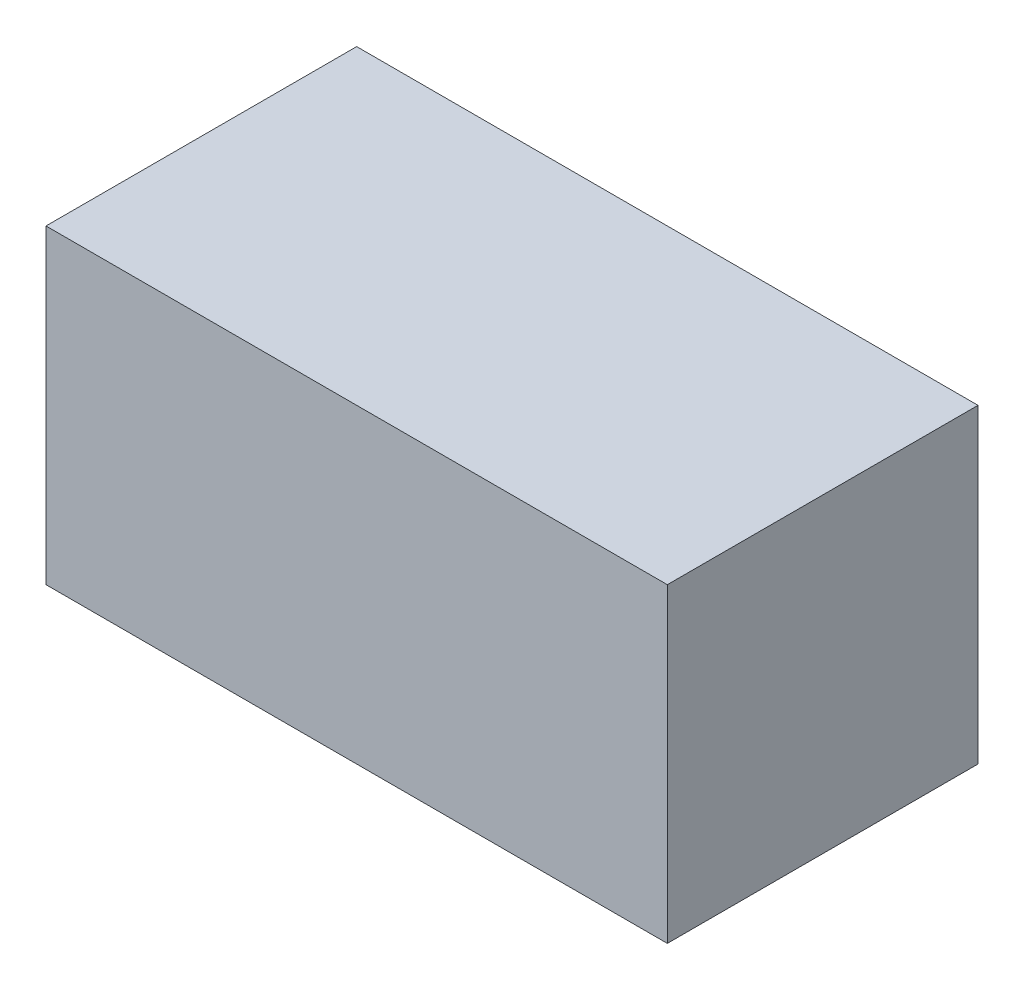
ISO-10303-21;
HEADER;
FILE_DESCRIPTION(('STEP AP214'),'2;1');
FILE_NAME('part.step','',(''),(''),'','','');
FILE_SCHEMA(('AUTOMOTIVE_DESIGN { 1 0 10303 214 1 1 1 1 }'));
ENDSEC;
DATA;
#1=APPLICATION_CONTEXT('core data for automotive mechanical design processes');
#2=APPLICATION_PROTOCOL_DEFINITION('international standard','automotive_design',2000,#1);
#3=PRODUCT_CONTEXT('',#1,'mechanical');
#4=PRODUCT('Part','Part','',(#3));
#5=PRODUCT_RELATED_PRODUCT_CATEGORY('part','',(#4));
#6=PRODUCT_DEFINITION_FORMATION('','',#4);
#7=PRODUCT_DEFINITION_CONTEXT('part definition',#1,'design');
#8=PRODUCT_DEFINITION('design','',#6,#7);
#9=PRODUCT_DEFINITION_SHAPE('','',#8);
#10=(LENGTH_UNIT() NAMED_UNIT(*) SI_UNIT(.MILLI.,.METRE.));
#11=(NAMED_UNIT(*) PLANE_ANGLE_UNIT() SI_UNIT($,.RADIAN.));
#12=(NAMED_UNIT(*) SI_UNIT($,.STERADIAN.) SOLID_ANGLE_UNIT());
#13=UNCERTAINTY_MEASURE_WITH_UNIT(LENGTH_MEASURE(1.E-05),#10,'distance_accuracy_value','');
#14=(GEOMETRIC_REPRESENTATION_CONTEXT(3) GLOBAL_UNCERTAINTY_ASSIGNED_CONTEXT((#13)) GLOBAL_UNIT_ASSIGNED_CONTEXT((#10,
#11,#12)) REPRESENTATION_CONTEXT('',''));
#15=CARTESIAN_POINT('',(0.,0.,0.));
#16=DIRECTION('',(0.,0.,1.));
#17=DIRECTION('',(1.,0.,0.));
#18=AXIS2_PLACEMENT_3D('',#15,#16,#17);
#19=CARTESIAN_POINT('',(0.,10.,0.));
#20=DIRECTION('',(1.,0.,0.));
#21=DIRECTION('',(0.,0.,-1.));
#22=AXIS2_PLACEMENT_3D('',#19,#20,#21);
#23=PLANE('',#22);
#24=DIRECTION('',(0.,0.,1.));
#25=VECTOR('',#24,1.);
#26=CARTESIAN_POINT('',(0.,0.,0.));
#27=LINE('',#26,#25);
#28=CARTESIAN_POINT('',(0.,0.,-10.));
#29=VERTEX_POINT('',#28);
#30=CARTESIAN_POINT('',(0.,0.,0.));
#31=VERTEX_POINT('',#30);
#32=EDGE_CURVE('E107',#29,#31,#27,.T.);
#33=ORIENTED_EDGE('',*,*,#32,.T.);
#34=DIRECTION('',(0.,-1.,0.));
#35=VECTOR('',#34,1.);
#36=CARTESIAN_POINT('',(0.,10.,0.));
#37=LINE('',#36,#35);
#38=CARTESIAN_POINT('',(0.,10.,0.));
#39=VERTEX_POINT('',#38);
#40=EDGE_CURVE('E11',#39,#31,#37,.T.);
#41=ORIENTED_EDGE('',*,*,#40,.F.);
#42=DIRECTION('',(0.,0.,1.));
#43=VECTOR('',#42,1.);
#44=CARTESIAN_POINT('',(0.,10.,0.));
#45=LINE('',#44,#43);
#46=CARTESIAN_POINT('',(0.,10.,-10.));
#47=VERTEX_POINT('',#46);
#48=EDGE_CURVE('E91',#47,#39,#45,.T.);
#49=ORIENTED_EDGE('',*,*,#48,.F.);
#50=DIRECTION('',(0.,-1.,0.));
#51=VECTOR('',#50,1.);
#52=CARTESIAN_POINT('',(0.,10.,-10.));
#53=LINE('',#52,#51);
#54=EDGE_CURVE('E103',#47,#29,#53,.T.);
#55=ORIENTED_EDGE('',*,*,#54,.T.);
#56=EDGE_LOOP('',(#33,#41,#49,#55));
#57=FACE_BOUND('',#56,.T.);
#58=ADVANCED_FACE('F39',(#57),#23,.F.);
#59=CARTESIAN_POINT('',(0.,10.,0.));
#60=DIRECTION('',(0.,0.,-1.));
#61=DIRECTION('',(-1.,0.,0.));
#62=AXIS2_PLACEMENT_3D('',#59,#60,#61);
#63=PLANE('',#62);
#64=DIRECTION('',(1.,0.,0.));
#65=VECTOR('',#64,1.);
#66=CARTESIAN_POINT('',(0.,0.,0.));
#67=LINE('',#66,#65);
#68=CARTESIAN_POINT('',(20.,0.,0.));
#69=VERTEX_POINT('',#68);
#70=EDGE_CURVE('E96',#31,#69,#67,.T.);
#71=ORIENTED_EDGE('',*,*,#70,.T.);
#72=DIRECTION('',(0.,-1.,0.));
#73=VECTOR('',#72,1.);
#74=CARTESIAN_POINT('',(20.,10.,0.));
#75=LINE('',#74,#73);
#76=CARTESIAN_POINT('',(20.,10.,0.));
#77=VERTEX_POINT('',#76);
#78=EDGE_CURVE('E48',#77,#69,#75,.T.);
#79=ORIENTED_EDGE('',*,*,#78,.F.);
#80=DIRECTION('',(1.,0.,0.));
#81=VECTOR('',#80,1.);
#82=CARTESIAN_POINT('',(0.,10.,0.));
#83=LINE('',#82,#81);
#84=EDGE_CURVE('E86',#39,#77,#83,.T.);
#85=ORIENTED_EDGE('',*,*,#84,.F.);
#86=ORIENTED_EDGE('',*,*,#40,.T.);
#87=EDGE_LOOP('',(#71,#79,#85,#86));
#88=FACE_BOUND('',#87,.T.);
#89=ADVANCED_FACE('F95',(#88),#63,.F.);
#90=CARTESIAN_POINT('',(20.,10.,0.));
#91=DIRECTION('',(-1.,0.,0.));
#92=DIRECTION('',(0.,0.,1.));
#93=AXIS2_PLACEMENT_3D('',#90,#91,#92);
#94=PLANE('',#93);
#95=DIRECTION('',(0.,0.,-1.));
#96=VECTOR('',#95,1.);
#97=CARTESIAN_POINT('',(20.,0.,0.));
#98=LINE('',#97,#96);
#99=CARTESIAN_POINT('',(20.,0.,-10.));
#100=VERTEX_POINT('',#99);
#101=EDGE_CURVE('E73',#69,#100,#98,.T.);
#102=ORIENTED_EDGE('',*,*,#101,.T.);
#103=DIRECTION('',(0.,-1.,0.));
#104=VECTOR('',#103,1.);
#105=CARTESIAN_POINT('',(20.,10.,-10.));
#106=LINE('',#105,#104);
#107=CARTESIAN_POINT('',(20.,10.,-10.));
#108=VERTEX_POINT('',#107);
#109=EDGE_CURVE('E98',#108,#100,#106,.T.);
#110=ORIENTED_EDGE('',*,*,#109,.F.);
#111=DIRECTION('',(0.,0.,-1.));
#112=VECTOR('',#111,1.);
#113=CARTESIAN_POINT('',(20.,10.,0.));
#114=LINE('',#113,#112);
#115=EDGE_CURVE('E89',#77,#108,#114,.T.);
#116=ORIENTED_EDGE('',*,*,#115,.F.);
#117=ORIENTED_EDGE('',*,*,#78,.T.);
#118=EDGE_LOOP('',(#102,#110,#116,#117));
#119=FACE_BOUND('',#118,.T.);
#120=ADVANCED_FACE('F99',(#119),#94,.F.);
#121=CARTESIAN_POINT('',(0.,10.,-10.));
#122=DIRECTION('',(0.,0.,1.));
#123=DIRECTION('',(1.,0.,0.));
#124=AXIS2_PLACEMENT_3D('',#121,#122,#123);
#125=PLANE('',#124);
#126=DIRECTION('',(-1.,0.,0.));
#127=VECTOR('',#126,1.);
#128=CARTESIAN_POINT('',(0.,0.,-10.));
#129=LINE('',#128,#127);
#130=EDGE_CURVE('E79',#100,#29,#129,.T.);
#131=ORIENTED_EDGE('',*,*,#130,.T.);
#132=ORIENTED_EDGE('',*,*,#54,.F.);
#133=DIRECTION('',(-1.,0.,0.));
#134=VECTOR('',#133,1.);
#135=CARTESIAN_POINT('',(0.,10.,-10.));
#136=LINE('',#135,#134);
#137=EDGE_CURVE('E56',#108,#47,#136,.T.);
#138=ORIENTED_EDGE('',*,*,#137,.F.);
#139=ORIENTED_EDGE('',*,*,#109,.T.);
#140=EDGE_LOOP('',(#131,#132,#138,#139));
#141=FACE_BOUND('',#140,.T.);
#142=ADVANCED_FACE('F120',(#141),#125,.F.);
#143=CARTESIAN_POINT('',(0.,10.,0.));
#144=DIRECTION('',(0.,-1.,0.));
#145=DIRECTION('',(0.,0.,-1.));
#146=AXIS2_PLACEMENT_3D('',#143,#144,#145);
#147=PLANE('',#146);
#148=ORIENTED_EDGE('',*,*,#48,.T.);
#149=ORIENTED_EDGE('',*,*,#84,.T.);
#150=ORIENTED_EDGE('',*,*,#115,.T.);
#151=ORIENTED_EDGE('',*,*,#137,.T.);
#152=EDGE_LOOP('',(#148,#149,#150,#151));
#153=FACE_BOUND('',#152,.T.);
#154=ADVANCED_FACE('F87',(#153),#147,.F.);
#155=CARTESIAN_POINT('',(0.,0.,0.));
#156=DIRECTION('',(0.,-1.,0.));
#157=DIRECTION('',(0.,0.,-1.));
#158=AXIS2_PLACEMENT_3D('',#155,#156,#157);
#159=PLANE('',#158);
#160=ORIENTED_EDGE('',*,*,#32,.F.);
#161=ORIENTED_EDGE('',*,*,#130,.F.);
#162=ORIENTED_EDGE('',*,*,#101,.F.);
#163=ORIENTED_EDGE('',*,*,#70,.F.);
#164=EDGE_LOOP('',(#160,#161,#162,#163));
#165=FACE_BOUND('',#164,.T.);
#166=ADVANCED_FACE('F123',(#165),#159,.T.);
#167=CLOSED_SHELL('',(#58,#89,#120,#142,#154,#166));
#168=MANIFOLD_SOLID_BREP('B2',#167);
#169=ADVANCED_BREP_SHAPE_REPRESENTATION('',(#18,#168),#14);
#170=SHAPE_DEFINITION_REPRESENTATION(#9,#169);
ENDSEC;
END-ISO-10303-21;
